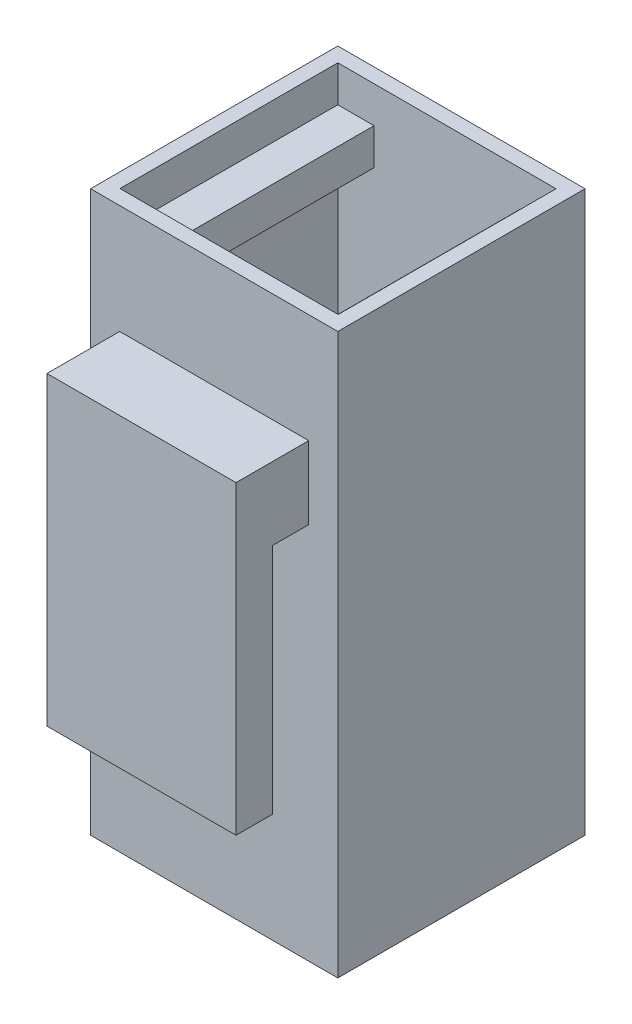
ISO-10303-21;
HEADER;
FILE_DESCRIPTION(('STEP AP214'),'2;1');
FILE_NAME('part.step','',(''),(''),'','','');
FILE_SCHEMA(('AUTOMOTIVE_DESIGN { 1 0 10303 214 1 1 1 1 }'));
ENDSEC;
DATA;
#1=APPLICATION_CONTEXT('core data for automotive mechanical design processes');
#2=APPLICATION_PROTOCOL_DEFINITION('international standard','automotive_design',2000,#1);
#3=PRODUCT_CONTEXT('',#1,'mechanical');
#4=PRODUCT('Part','Part','',(#3));
#5=PRODUCT_RELATED_PRODUCT_CATEGORY('part','',(#4));
#6=PRODUCT_DEFINITION_FORMATION('','',#4);
#7=PRODUCT_DEFINITION_CONTEXT('part definition',#1,'design');
#8=PRODUCT_DEFINITION('design','',#6,#7);
#9=PRODUCT_DEFINITION_SHAPE('','',#8);
#10=(LENGTH_UNIT() NAMED_UNIT(*) SI_UNIT(.MILLI.,.METRE.));
#11=(NAMED_UNIT(*) PLANE_ANGLE_UNIT() SI_UNIT($,.RADIAN.));
#12=(NAMED_UNIT(*) SI_UNIT($,.STERADIAN.) SOLID_ANGLE_UNIT());
#13=UNCERTAINTY_MEASURE_WITH_UNIT(LENGTH_MEASURE(1.E-05),#10,'distance_accuracy_value','');
#14=(GEOMETRIC_REPRESENTATION_CONTEXT(3) GLOBAL_UNCERTAINTY_ASSIGNED_CONTEXT((#13)) GLOBAL_UNIT_ASSIGNED_CONTEXT((#10,
#11,#12)) REPRESENTATION_CONTEXT('',''));
#15=CARTESIAN_POINT('',(0.,0.,0.));
#16=DIRECTION('',(0.,0.,1.));
#17=DIRECTION('',(1.,0.,0.));
#18=AXIS2_PLACEMENT_3D('',#15,#16,#17);
#19=CARTESIAN_POINT('',(-2.,75.,32.));
#20=DIRECTION('',(0.,0.,-1.));
#21=DIRECTION('',(-1.,0.,0.));
#22=AXIS2_PLACEMENT_3D('',#19,#20,#21);
#23=PLANE('',#22);
#24=DIRECTION('',(0.,1.,0.));
#25=VECTOR('',#24,1.);
#26=CARTESIAN_POINT('',(28.,60.,32.));
#27=LINE('',#26,#25);
#28=CARTESIAN_POINT('',(28.,50.,32.));
#29=VERTEX_POINT('',#28);
#30=CARTESIAN_POINT('',(28.,60.,32.));
#31=VERTEX_POINT('',#30);
#32=EDGE_CURVE('E240',#29,#31,#27,.T.);
#33=ORIENTED_EDGE('',*,*,#32,.F.);
#34=DIRECTION('',(-1.,0.,0.));
#35=VECTOR('',#34,1.);
#36=CARTESIAN_POINT('',(30.,50.,32.));
#37=LINE('',#36,#35);
#38=CARTESIAN_POINT('',(2.,50.,32.));
#39=VERTEX_POINT('',#38);
#40=EDGE_CURVE('E202',#29,#39,#37,.T.);
#41=ORIENTED_EDGE('',*,*,#40,.T.);
#42=DIRECTION('',(0.,-1.,0.));
#43=VECTOR('',#42,1.);
#44=CARTESIAN_POINT('',(2.,60.,32.));
#45=LINE('',#44,#43);
#46=CARTESIAN_POINT('',(2.,60.,32.));
#47=VERTEX_POINT('',#46);
#48=EDGE_CURVE('E71',#47,#39,#45,.T.);
#49=ORIENTED_EDGE('',*,*,#48,.F.);
#50=DIRECTION('',(-1.,0.,0.));
#51=VECTOR('',#50,1.);
#52=CARTESIAN_POINT('',(2.,60.,32.));
#53=LINE('',#52,#51);
#54=EDGE_CURVE('E228',#31,#47,#53,.T.);
#55=ORIENTED_EDGE('',*,*,#54,.F.);
#56=EDGE_LOOP('',(#33,#41,#49,#55));
#57=FACE_BOUND('',#56,.T.);
#58=DIRECTION('',(0.,-1.,0.));
#59=VECTOR('',#58,1.);
#60=CARTESIAN_POINT('',(-2.,75.,32.));
#61=LINE('',#60,#59);
#62=CARTESIAN_POINT('',(-2.,75.,32.));
#63=VERTEX_POINT('',#62);
#64=CARTESIAN_POINT('',(-2.,-2.,32.));
#65=VERTEX_POINT('',#64);
#66=EDGE_CURVE('E426',#63,#65,#61,.T.);
#67=ORIENTED_EDGE('',*,*,#66,.T.);
#68=DIRECTION('',(-1.,0.,0.));
#69=VECTOR('',#68,1.);
#70=CARTESIAN_POINT('',(-2.,-2.,32.));
#71=LINE('',#70,#69);
#72=CARTESIAN_POINT('',(32.,-2.,32.));
#73=VERTEX_POINT('',#72);
#74=EDGE_CURVE('E258',#73,#65,#71,.T.);
#75=ORIENTED_EDGE('',*,*,#74,.F.);
#76=DIRECTION('',(0.,-1.,0.));
#77=VECTOR('',#76,1.);
#78=CARTESIAN_POINT('',(32.,75.,32.));
#79=LINE('',#78,#77);
#80=CARTESIAN_POINT('',(32.,75.,32.));
#81=VERTEX_POINT('',#80);
#82=EDGE_CURVE('E423',#81,#73,#79,.T.);
#83=ORIENTED_EDGE('',*,*,#82,.F.);
#84=DIRECTION('',(1.,0.,0.));
#85=VECTOR('',#84,1.);
#86=CARTESIAN_POINT('',(-2.,75.,32.));
#87=LINE('',#86,#85);
#88=EDGE_CURVE('E408',#63,#81,#87,.T.);
#89=ORIENTED_EDGE('',*,*,#88,.F.);
#90=EDGE_LOOP('',(#67,#75,#83,#89));
#91=FACE_BOUND('',#90,.T.);
#92=ADVANCED_FACE('F47',(#57,#91),#23,.F.);
#93=CARTESIAN_POINT('',(0.,75.,0.));
#94=DIRECTION('',(0.,1.,0.));
#95=DIRECTION('',(0.,0.,1.));
#96=AXIS2_PLACEMENT_3D('',#93,#94,#95);
#97=PLANE('',#96);
#98=DIRECTION('',(-1.,0.,0.));
#99=VECTOR('',#98,1.);
#100=CARTESIAN_POINT('',(0.,75.,0.));
#101=LINE('',#100,#99);
#102=CARTESIAN_POINT('',(30.007946466563,75.,0.));
#103=VERTEX_POINT('',#102);
#104=CARTESIAN_POINT('',(0.,75.,0.));
#105=VERTEX_POINT('',#104);
#106=EDGE_CURVE('E373',#103,#105,#101,.T.);
#107=ORIENTED_EDGE('',*,*,#106,.F.);
#108=DIRECTION('',(0.,0.,-1.));
#109=VECTOR('',#108,1.);
#110=CARTESIAN_POINT('',(30.007946466563,75.,0.));
#111=LINE('',#110,#109);
#112=CARTESIAN_POINT('',(30.007946466563,75.,29.9509599856431));
#113=VERTEX_POINT('',#112);
#114=EDGE_CURVE('E279',#113,#103,#111,.T.);
#115=ORIENTED_EDGE('',*,*,#114,.F.);
#116=DIRECTION('',(1.,0.,0.));
#117=VECTOR('',#116,1.);
#118=CARTESIAN_POINT('',(30.007946466563,75.,29.9509599856431));
#119=LINE('',#118,#117);
#120=CARTESIAN_POINT('',(0.,75.,29.9509599856431));
#121=VERTEX_POINT('',#120);
#122=EDGE_CURVE('E309',#121,#113,#119,.T.);
#123=ORIENTED_EDGE('',*,*,#122,.F.);
#124=DIRECTION('',(0.,0.,1.));
#125=VECTOR('',#124,1.);
#126=CARTESIAN_POINT('',(0.,75.,29.9509599856431));
#127=LINE('',#126,#125);
#128=EDGE_CURVE('E274',#105,#121,#127,.T.);
#129=ORIENTED_EDGE('',*,*,#128,.F.);
#130=EDGE_LOOP('',(#107,#115,#123,#129));
#131=FACE_BOUND('',#130,.T.);
#132=DIRECTION('',(0.,0.,1.));
#133=VECTOR('',#132,1.);
#134=CARTESIAN_POINT('',(-2.,75.,-2.));
#135=LINE('',#134,#133);
#136=CARTESIAN_POINT('',(-2.,75.,-2.));
#137=VERTEX_POINT('',#136);
#138=EDGE_CURVE('E404',#137,#63,#135,.T.);
#139=ORIENTED_EDGE('',*,*,#138,.T.);
#140=ORIENTED_EDGE('',*,*,#88,.T.);
#141=DIRECTION('',(0.,0.,-1.));
#142=VECTOR('',#141,1.);
#143=CARTESIAN_POINT('',(32.,75.,-2.));
#144=LINE('',#143,#142);
#145=CARTESIAN_POINT('',(32.,75.,-2.));
#146=VERTEX_POINT('',#145);
#147=EDGE_CURVE('E411',#81,#146,#144,.T.);
#148=ORIENTED_EDGE('',*,*,#147,.T.);
#149=DIRECTION('',(-1.,0.,0.));
#150=VECTOR('',#149,1.);
#151=CARTESIAN_POINT('',(-2.,75.,-2.));
#152=LINE('',#151,#150);
#153=EDGE_CURVE('E414',#146,#137,#152,.T.);
#154=ORIENTED_EDGE('',*,*,#153,.T.);
#155=EDGE_LOOP('',(#139,#140,#148,#154));
#156=FACE_BOUND('',#155,.T.);
#157=ADVANCED_FACE('F446',(#131,#156),#97,.T.);
#158=CARTESIAN_POINT('',(-2.,75.,-2.));
#159=DIRECTION('',(1.,0.,0.));
#160=DIRECTION('',(0.,0.,-1.));
#161=AXIS2_PLACEMENT_3D('',#158,#159,#160);
#162=PLANE('',#161);
#163=DIRECTION('',(0.,-1.,0.));
#164=VECTOR('',#163,1.);
#165=CARTESIAN_POINT('',(-2.,75.,-2.));
#166=LINE('',#165,#164);
#167=CARTESIAN_POINT('',(-2.,-2.,-2.));
#168=VERTEX_POINT('',#167);
#169=EDGE_CURVE('E417',#137,#168,#166,.T.);
#170=ORIENTED_EDGE('',*,*,#169,.T.);
#171=DIRECTION('',(0.,0.,-1.));
#172=VECTOR('',#171,1.);
#173=CARTESIAN_POINT('',(-2.,-2.,32.));
#174=LINE('',#173,#172);
#175=EDGE_CURVE('E262',#65,#168,#174,.T.);
#176=ORIENTED_EDGE('',*,*,#175,.F.);
#177=ORIENTED_EDGE('',*,*,#66,.F.);
#178=ORIENTED_EDGE('',*,*,#138,.F.);
#179=EDGE_LOOP('',(#170,#176,#177,#178));
#180=FACE_BOUND('',#179,.T.);
#181=ADVANCED_FACE('F49',(#180),#162,.F.);
#182=CARTESIAN_POINT('',(32.,75.,-2.));
#183=DIRECTION('',(-1.,0.,0.));
#184=DIRECTION('',(0.,0.,1.));
#185=AXIS2_PLACEMENT_3D('',#182,#183,#184);
#186=PLANE('',#185);
#187=ORIENTED_EDGE('',*,*,#82,.T.);
#188=DIRECTION('',(0.,0.,1.));
#189=VECTOR('',#188,1.);
#190=CARTESIAN_POINT('',(32.,-2.,32.));
#191=LINE('',#190,#189);
#192=CARTESIAN_POINT('',(32.,-2.,-1.99999999999999));
#193=VERTEX_POINT('',#192);
#194=EDGE_CURVE('E270',#193,#73,#191,.T.);
#195=ORIENTED_EDGE('',*,*,#194,.F.);
#196=DIRECTION('',(0.,-1.,0.));
#197=VECTOR('',#196,1.);
#198=CARTESIAN_POINT('',(32.,75.,-2.));
#199=LINE('',#198,#197);
#200=EDGE_CURVE('E420',#146,#193,#199,.T.);
#201=ORIENTED_EDGE('',*,*,#200,.F.);
#202=ORIENTED_EDGE('',*,*,#147,.F.);
#203=EDGE_LOOP('',(#187,#195,#201,#202));
#204=FACE_BOUND('',#203,.T.);
#205=ADVANCED_FACE('F460',(#204),#186,.F.);
#206=CARTESIAN_POINT('',(-2.,75.,-2.));
#207=DIRECTION('',(0.,0.,1.));
#208=DIRECTION('',(1.,0.,0.));
#209=AXIS2_PLACEMENT_3D('',#206,#207,#208);
#210=PLANE('',#209);
#211=ORIENTED_EDGE('',*,*,#200,.T.);
#212=DIRECTION('',(1.,0.,0.));
#213=VECTOR('',#212,1.);
#214=CARTESIAN_POINT('',(-2.,-2.,-2.));
#215=LINE('',#214,#213);
#216=EDGE_CURVE('E266',#168,#193,#215,.T.);
#217=ORIENTED_EDGE('',*,*,#216,.F.);
#218=ORIENTED_EDGE('',*,*,#169,.F.);
#219=ORIENTED_EDGE('',*,*,#153,.F.);
#220=EDGE_LOOP('',(#211,#217,#218,#219));
#221=FACE_BOUND('',#220,.T.);
#222=ADVANCED_FACE('F465',(#221),#210,.F.);
#223=CARTESIAN_POINT('',(0.,75.,0.));
#224=DIRECTION('',(1.,0.,0.));
#225=DIRECTION('',(0.,0.,-1.));
#226=AXIS2_PLACEMENT_3D('',#223,#224,#225);
#227=PLANE('',#226);
#228=DIRECTION('',(0.,0.,1.));
#229=VECTOR('',#228,1.);
#230=CARTESIAN_POINT('',(0.,65.0000000000001,30.));
#231=LINE('',#230,#229);
#232=CARTESIAN_POINT('',(0.,65.0000000000001,0.));
#233=VERTEX_POINT('',#232);
#234=CARTESIAN_POINT('',(0.,65.0000000000001,30.));
#235=VERTEX_POINT('',#234);
#236=EDGE_CURVE('E320',#233,#235,#231,.T.);
#237=ORIENTED_EDGE('',*,*,#236,.T.);
#238=DIRECTION('',(0.,-1.,0.));
#239=VECTOR('',#238,1.);
#240=CARTESIAN_POINT('',(0.,75.,30.));
#241=LINE('',#240,#239);
#242=CARTESIAN_POINT('',(0.,0.,30.));
#243=VERTEX_POINT('',#242);
#244=EDGE_CURVE('E401',#235,#243,#241,.T.);
#245=ORIENTED_EDGE('',*,*,#244,.T.);
#246=DIRECTION('',(0.,0.,1.));
#247=VECTOR('',#246,1.);
#248=CARTESIAN_POINT('',(0.,0.,0.));
#249=LINE('',#248,#247);
#250=CARTESIAN_POINT('',(0.,0.,0.));
#251=VERTEX_POINT('',#250);
#252=EDGE_CURVE('E361',#251,#243,#249,.T.);
#253=ORIENTED_EDGE('',*,*,#252,.F.);
#254=DIRECTION('',(0.,-1.,0.));
#255=VECTOR('',#254,1.);
#256=CARTESIAN_POINT('',(0.,75.,0.));
#257=LINE('',#256,#255);
#258=EDGE_CURVE('E376',#233,#251,#257,.T.);
#259=ORIENTED_EDGE('',*,*,#258,.F.);
#260=EDGE_LOOP('',(#237,#245,#253,#259));
#261=FACE_BOUND('',#260,.T.);
#262=ADVANCED_FACE('F467',(#261),#227,.T.);
#263=CARTESIAN_POINT('',(0.,75.,30.));
#264=DIRECTION('',(0.,0.,-1.));
#265=DIRECTION('',(-1.,0.,0.));
#266=AXIS2_PLACEMENT_3D('',#263,#264,#265);
#267=PLANE('',#266);
#268=DIRECTION('',(1.,0.,0.));
#269=VECTOR('',#268,1.);
#270=CARTESIAN_POINT('',(30.,65.0000000000001,30.));
#271=LINE('',#270,#269);
#272=CARTESIAN_POINT('',(30.,65.0000000000001,30.));
#273=VERTEX_POINT('',#272);
#274=EDGE_CURVE('E332',#235,#273,#271,.T.);
#275=ORIENTED_EDGE('',*,*,#274,.T.);
#276=DIRECTION('',(0.,-1.,0.));
#277=VECTOR('',#276,1.);
#278=CARTESIAN_POINT('',(30.,75.,30.));
#279=LINE('',#278,#277);
#280=CARTESIAN_POINT('',(30.,0.,30.));
#281=VERTEX_POINT('',#280);
#282=EDGE_CURVE('E398',#273,#281,#279,.T.);
#283=ORIENTED_EDGE('',*,*,#282,.T.);
#284=DIRECTION('',(1.,0.,0.));
#285=VECTOR('',#284,1.);
#286=CARTESIAN_POINT('',(0.,0.,30.));
#287=LINE('',#286,#285);
#288=EDGE_CURVE('E381',#243,#281,#287,.T.);
#289=ORIENTED_EDGE('',*,*,#288,.F.);
#290=ORIENTED_EDGE('',*,*,#244,.F.);
#291=EDGE_LOOP('',(#275,#283,#289,#290));
#292=FACE_BOUND('',#291,.T.);
#293=ADVANCED_FACE('F473',(#292),#267,.T.);
#294=CARTESIAN_POINT('',(30.,75.,0.));
#295=DIRECTION('',(-1.,0.,0.));
#296=DIRECTION('',(0.,0.,1.));
#297=AXIS2_PLACEMENT_3D('',#294,#295,#296);
#298=PLANE('',#297);
#299=DIRECTION('',(0.,0.,-1.));
#300=VECTOR('',#299,1.);
#301=CARTESIAN_POINT('',(30.,65.0000000000001,0.));
#302=LINE('',#301,#300);
#303=CARTESIAN_POINT('',(30.,65.0000000000001,0.));
#304=VERTEX_POINT('',#303);
#305=EDGE_CURVE('E335',#273,#304,#302,.T.);
#306=ORIENTED_EDGE('',*,*,#305,.T.);
#307=DIRECTION('',(0.,-1.,0.));
#308=VECTOR('',#307,1.);
#309=CARTESIAN_POINT('',(30.,75.,0.));
#310=LINE('',#309,#308);
#311=CARTESIAN_POINT('',(30.,0.,0.));
#312=VERTEX_POINT('',#311);
#313=EDGE_CURVE('E395',#304,#312,#310,.T.);
#314=ORIENTED_EDGE('',*,*,#313,.T.);
#315=DIRECTION('',(0.,0.,-1.));
#316=VECTOR('',#315,1.);
#317=CARTESIAN_POINT('',(30.,0.,0.));
#318=LINE('',#317,#316);
#319=EDGE_CURVE('E385',#281,#312,#318,.T.);
#320=ORIENTED_EDGE('',*,*,#319,.F.);
#321=ORIENTED_EDGE('',*,*,#282,.F.);
#322=EDGE_LOOP('',(#306,#314,#320,#321));
#323=FACE_BOUND('',#322,.T.);
#324=ADVANCED_FACE('F483',(#323),#298,.T.);
#325=CARTESIAN_POINT('',(0.,75.,0.));
#326=DIRECTION('',(0.,0.,1.));
#327=DIRECTION('',(1.,0.,0.));
#328=AXIS2_PLACEMENT_3D('',#325,#326,#327);
#329=PLANE('',#328);
#330=DIRECTION('',(0.,1.,0.));
#331=VECTOR('',#330,1.);
#332=CARTESIAN_POINT('',(4.98170601426861,65.0000000000001,0.));
#333=LINE('',#332,#331);
#334=CARTESIAN_POINT('',(4.98170601426861,65.0000000000001,0.));
#335=VERTEX_POINT('',#334);
#336=CARTESIAN_POINT('',(4.98170601426861,70.,0.));
#337=VERTEX_POINT('',#336);
#338=EDGE_CURVE('E357',#335,#337,#333,.T.);
#339=ORIENTED_EDGE('',*,*,#338,.F.);
#340=DIRECTION('',(-1.,0.,0.));
#341=VECTOR('',#340,1.);
#342=CARTESIAN_POINT('',(0.,65.0000000000001,0.));
#343=LINE('',#342,#341);
#344=EDGE_CURVE('E353',#335,#233,#343,.T.);
#345=ORIENTED_EDGE('',*,*,#344,.T.);
#346=ORIENTED_EDGE('',*,*,#258,.T.);
#347=DIRECTION('',(-1.,0.,0.));
#348=VECTOR('',#347,1.);
#349=CARTESIAN_POINT('',(0.,0.,0.));
#350=LINE('',#349,#348);
#351=EDGE_CURVE('E377',#312,#251,#350,.T.);
#352=ORIENTED_EDGE('',*,*,#351,.F.);
#353=ORIENTED_EDGE('',*,*,#313,.F.);
#354=DIRECTION('',(-1.,0.,0.));
#355=VECTOR('',#354,1.);
#356=CARTESIAN_POINT('',(24.9817060142686,65.0000000000001,0.));
#357=LINE('',#356,#355);
#358=CARTESIAN_POINT('',(24.9817060142686,65.0000000000001,0.));
#359=VERTEX_POINT('',#358);
#360=EDGE_CURVE('E338',#304,#359,#357,.T.);
#361=ORIENTED_EDGE('',*,*,#360,.T.);
#362=DIRECTION('',(0.,1.,0.));
#363=VECTOR('',#362,1.);
#364=CARTESIAN_POINT('',(24.9817060142686,65.0000000000001,0.));
#365=LINE('',#364,#363);
#366=CARTESIAN_POINT('',(24.9817060142686,70.,0.));
#367=VERTEX_POINT('',#366);
#368=EDGE_CURVE('E356',#359,#367,#365,.T.);
#369=ORIENTED_EDGE('',*,*,#368,.T.);
#370=DIRECTION('',(-1.,0.,0.));
#371=VECTOR('',#370,1.);
#372=CARTESIAN_POINT('',(24.9817060142686,70.,0.));
#373=LINE('',#372,#371);
#374=CARTESIAN_POINT('',(30.007946466563,70.,0.));
#375=VERTEX_POINT('',#374);
#376=EDGE_CURVE('E302',#375,#367,#373,.T.);
#377=ORIENTED_EDGE('',*,*,#376,.F.);
#378=DIRECTION('',(0.,1.,0.));
#379=VECTOR('',#378,1.);
#380=CARTESIAN_POINT('',(30.007946466563,70.,0.));
#381=LINE('',#380,#379);
#382=EDGE_CURVE('E316',#375,#103,#381,.T.);
#383=ORIENTED_EDGE('',*,*,#382,.T.);
#384=ORIENTED_EDGE('',*,*,#106,.T.);
#385=DIRECTION('',(0.,1.,0.));
#386=VECTOR('',#385,1.);
#387=CARTESIAN_POINT('',(0.,70.,0.));
#388=LINE('',#387,#386);
#389=CARTESIAN_POINT('',(0.,70.,0.));
#390=VERTEX_POINT('',#389);
#391=EDGE_CURVE('E305',#390,#105,#388,.T.);
#392=ORIENTED_EDGE('',*,*,#391,.F.);
#393=DIRECTION('',(-1.,0.,0.));
#394=VECTOR('',#393,1.);
#395=CARTESIAN_POINT('',(0.,70.,0.));
#396=LINE('',#395,#394);
#397=EDGE_CURVE('E286',#337,#390,#396,.T.);
#398=ORIENTED_EDGE('',*,*,#397,.F.);
#399=EDGE_LOOP('',(#339,#345,#346,#352,#353,#361,#369,#377,#383,#384,#392,#398));
#400=FACE_BOUND('',#399,.T.);
#401=ADVANCED_FACE('F487',(#400),#329,.T.);
#402=CARTESIAN_POINT('',(4.98170601426861,65.0000000000001,0.));
#403=DIRECTION('',(1.,0.,0.));
#404=DIRECTION('',(0.,0.,-1.));
#405=AXIS2_PLACEMENT_3D('',#402,#403,#404);
#406=PLANE('',#405);
#407=DIRECTION('',(0.,0.,-1.));
#408=VECTOR('',#407,1.);
#409=CARTESIAN_POINT('',(4.98170601426861,70.,0.));
#410=LINE('',#409,#408);
#411=CARTESIAN_POINT('',(4.98170601426861,70.,25.));
#412=VERTEX_POINT('',#411);
#413=EDGE_CURVE('E282',#412,#337,#410,.T.);
#414=ORIENTED_EDGE('',*,*,#413,.F.);
#415=DIRECTION('',(0.,1.,0.));
#416=VECTOR('',#415,1.);
#417=CARTESIAN_POINT('',(4.98170601426861,65.0000000000001,25.));
#418=LINE('',#417,#416);
#419=CARTESIAN_POINT('',(4.98170601426861,65.0000000000001,25.));
#420=VERTEX_POINT('',#419);
#421=EDGE_CURVE('E362',#420,#412,#418,.T.);
#422=ORIENTED_EDGE('',*,*,#421,.F.);
#423=DIRECTION('',(0.,0.,-1.));
#424=VECTOR('',#423,1.);
#425=CARTESIAN_POINT('',(4.98170601426861,65.0000000000001,0.));
#426=LINE('',#425,#424);
#427=EDGE_CURVE('E349',#420,#335,#426,.T.);
#428=ORIENTED_EDGE('',*,*,#427,.T.);
#429=ORIENTED_EDGE('',*,*,#338,.T.);
#430=EDGE_LOOP('',(#414,#422,#428,#429));
#431=FACE_BOUND('',#430,.T.);
#432=ADVANCED_FACE('F491',(#431),#406,.T.);
#433=CARTESIAN_POINT('',(4.98170601426861,65.0000000000001,25.));
#434=DIRECTION('',(0.,0.,-1.));
#435=DIRECTION('',(-1.,0.,0.));
#436=AXIS2_PLACEMENT_3D('',#433,#434,#435);
#437=PLANE('',#436);
#438=DIRECTION('',(-1.,0.,0.));
#439=VECTOR('',#438,1.);
#440=CARTESIAN_POINT('',(4.98170601426861,70.,25.));
#441=LINE('',#440,#439);
#442=CARTESIAN_POINT('',(24.9817060142686,70.,25.));
#443=VERTEX_POINT('',#442);
#444=EDGE_CURVE('E278',#443,#412,#441,.T.);
#445=ORIENTED_EDGE('',*,*,#444,.F.);
#446=DIRECTION('',(0.,1.,0.));
#447=VECTOR('',#446,1.);
#448=CARTESIAN_POINT('',(24.9817060142686,65.0000000000001,25.));
#449=LINE('',#448,#447);
#450=CARTESIAN_POINT('',(24.9817060142686,65.0000000000001,25.));
#451=VERTEX_POINT('',#450);
#452=EDGE_CURVE('E366',#451,#443,#449,.T.);
#453=ORIENTED_EDGE('',*,*,#452,.F.);
#454=DIRECTION('',(-1.,0.,0.));
#455=VECTOR('',#454,1.);
#456=CARTESIAN_POINT('',(4.98170601426861,65.0000000000001,25.));
#457=LINE('',#456,#455);
#458=EDGE_CURVE('E345',#451,#420,#457,.T.);
#459=ORIENTED_EDGE('',*,*,#458,.T.);
#460=ORIENTED_EDGE('',*,*,#421,.T.);
#461=EDGE_LOOP('',(#445,#453,#459,#460));
#462=FACE_BOUND('',#461,.T.);
#463=ADVANCED_FACE('F497',(#462),#437,.T.);
#464=CARTESIAN_POINT('',(24.9817060142686,65.0000000000001,25.));
#465=DIRECTION('',(-1.,0.,0.));
#466=DIRECTION('',(0.,0.,1.));
#467=AXIS2_PLACEMENT_3D('',#464,#465,#466);
#468=PLANE('',#467);
#469=DIRECTION('',(0.,0.,1.));
#470=VECTOR('',#469,1.);
#471=CARTESIAN_POINT('',(24.9817060142686,70.,25.));
#472=LINE('',#471,#470);
#473=EDGE_CURVE('E275',#367,#443,#472,.T.);
#474=ORIENTED_EDGE('',*,*,#473,.F.);
#475=ORIENTED_EDGE('',*,*,#368,.F.);
#476=DIRECTION('',(0.,0.,1.));
#477=VECTOR('',#476,1.);
#478=CARTESIAN_POINT('',(24.9817060142686,65.0000000000001,25.));
#479=LINE('',#478,#477);
#480=EDGE_CURVE('E341',#359,#451,#479,.T.);
#481=ORIENTED_EDGE('',*,*,#480,.T.);
#482=ORIENTED_EDGE('',*,*,#452,.T.);
#483=EDGE_LOOP('',(#474,#475,#481,#482));
#484=FACE_BOUND('',#483,.T.);
#485=ADVANCED_FACE('F493',(#484),#468,.T.);
#486=CARTESIAN_POINT('',(0.,65.0000000000001,0.));
#487=DIRECTION('',(0.,-1.,0.));
#488=DIRECTION('',(0.,0.,-1.));
#489=AXIS2_PLACEMENT_3D('',#486,#487,#488);
#490=PLANE('',#489);
#491=ORIENTED_EDGE('',*,*,#236,.F.);
#492=ORIENTED_EDGE('',*,*,#344,.F.);
#493=ORIENTED_EDGE('',*,*,#427,.F.);
#494=ORIENTED_EDGE('',*,*,#458,.F.);
#495=ORIENTED_EDGE('',*,*,#480,.F.);
#496=ORIENTED_EDGE('',*,*,#360,.F.);
#497=ORIENTED_EDGE('',*,*,#305,.F.);
#498=ORIENTED_EDGE('',*,*,#274,.F.);
#499=EDGE_LOOP('',(#491,#492,#493,#494,#495,#496,#497,#498));
#500=FACE_BOUND('',#499,.T.);
#501=ADVANCED_FACE('F496',(#500),#490,.T.);
#502=CARTESIAN_POINT('',(30.007946466563,70.,0.));
#503=DIRECTION('',(1.,0.,0.));
#504=DIRECTION('',(0.,0.,-1.));
#505=AXIS2_PLACEMENT_3D('',#502,#503,#504);
#506=PLANE('',#505);
#507=ORIENTED_EDGE('',*,*,#114,.T.);
#508=ORIENTED_EDGE('',*,*,#382,.F.);
#509=DIRECTION('',(0.,0.,-1.));
#510=VECTOR('',#509,1.);
#511=CARTESIAN_POINT('',(30.007946466563,70.,0.));
#512=LINE('',#511,#510);
#513=CARTESIAN_POINT('',(30.007946466563,70.,29.9509599856431));
#514=VERTEX_POINT('',#513);
#515=EDGE_CURVE('E298',#514,#375,#512,.T.);
#516=ORIENTED_EDGE('',*,*,#515,.F.);
#517=DIRECTION('',(0.,1.,0.));
#518=VECTOR('',#517,1.);
#519=CARTESIAN_POINT('',(30.007946466563,70.,29.9509599856431));
#520=LINE('',#519,#518);
#521=EDGE_CURVE('E321',#514,#113,#520,.T.);
#522=ORIENTED_EDGE('',*,*,#521,.T.);
#523=EDGE_LOOP('',(#507,#508,#516,#522));
#524=FACE_BOUND('',#523,.T.);
#525=ADVANCED_FACE('F507',(#524),#506,.F.);
#526=CARTESIAN_POINT('',(30.007946466563,70.,29.9509599856431));
#527=DIRECTION('',(0.,0.,1.));
#528=DIRECTION('',(1.,0.,0.));
#529=AXIS2_PLACEMENT_3D('',#526,#527,#528);
#530=PLANE('',#529);
#531=ORIENTED_EDGE('',*,*,#122,.T.);
#532=ORIENTED_EDGE('',*,*,#521,.F.);
#533=DIRECTION('',(1.,0.,0.));
#534=VECTOR('',#533,1.);
#535=CARTESIAN_POINT('',(30.007946466563,70.,29.9509599856431));
#536=LINE('',#535,#534);
#537=CARTESIAN_POINT('',(0.,70.,29.9509599856431));
#538=VERTEX_POINT('',#537);
#539=EDGE_CURVE('E294',#538,#514,#536,.T.);
#540=ORIENTED_EDGE('',*,*,#539,.F.);
#541=DIRECTION('',(0.,1.,0.));
#542=VECTOR('',#541,1.);
#543=CARTESIAN_POINT('',(0.,70.,29.9509599856431));
#544=LINE('',#543,#542);
#545=EDGE_CURVE('E324',#538,#121,#544,.T.);
#546=ORIENTED_EDGE('',*,*,#545,.T.);
#547=EDGE_LOOP('',(#531,#532,#540,#546));
#548=FACE_BOUND('',#547,.T.);
#549=ADVANCED_FACE('F513',(#548),#530,.F.);
#550=CARTESIAN_POINT('',(0.,70.,29.9509599856431));
#551=DIRECTION('',(-1.,0.,0.));
#552=DIRECTION('',(0.,0.,1.));
#553=AXIS2_PLACEMENT_3D('',#550,#551,#552);
#554=PLANE('',#553);
#555=ORIENTED_EDGE('',*,*,#128,.T.);
#556=ORIENTED_EDGE('',*,*,#545,.F.);
#557=DIRECTION('',(0.,0.,1.));
#558=VECTOR('',#557,1.);
#559=CARTESIAN_POINT('',(0.,70.,29.9509599856431));
#560=LINE('',#559,#558);
#561=EDGE_CURVE('E290',#390,#538,#560,.T.);
#562=ORIENTED_EDGE('',*,*,#561,.F.);
#563=ORIENTED_EDGE('',*,*,#391,.T.);
#564=EDGE_LOOP('',(#555,#556,#562,#563));
#565=FACE_BOUND('',#564,.T.);
#566=ADVANCED_FACE('F509',(#565),#554,.F.);
#567=CARTESIAN_POINT('',(0.,70.,0.));
#568=DIRECTION('',(0.,-1.,0.));
#569=DIRECTION('',(0.,0.,-1.));
#570=AXIS2_PLACEMENT_3D('',#567,#568,#569);
#571=PLANE('',#570);
#572=ORIENTED_EDGE('',*,*,#473,.T.);
#573=ORIENTED_EDGE('',*,*,#444,.T.);
#574=ORIENTED_EDGE('',*,*,#413,.T.);
#575=ORIENTED_EDGE('',*,*,#397,.T.);
#576=ORIENTED_EDGE('',*,*,#561,.T.);
#577=ORIENTED_EDGE('',*,*,#539,.T.);
#578=ORIENTED_EDGE('',*,*,#515,.T.);
#579=ORIENTED_EDGE('',*,*,#376,.T.);
#580=EDGE_LOOP('',(#572,#573,#574,#575,#576,#577,#578,#579));
#581=FACE_BOUND('',#580,.T.);
#582=ADVANCED_FACE('F512',(#581),#571,.F.);
#583=CARTESIAN_POINT('',(0.,0.,0.));
#584=DIRECTION('',(0.,1.,0.));
#585=DIRECTION('',(0.,0.,1.));
#586=AXIS2_PLACEMENT_3D('',#583,#584,#585);
#587=PLANE('',#586);
#588=ORIENTED_EDGE('',*,*,#351,.T.);
#589=ORIENTED_EDGE('',*,*,#252,.T.);
#590=ORIENTED_EDGE('',*,*,#288,.T.);
#591=ORIENTED_EDGE('',*,*,#319,.T.);
#592=EDGE_LOOP('',(#588,#589,#590,#591));
#593=FACE_BOUND('',#592,.T.);
#594=ADVANCED_FACE('F523',(#593),#587,.T.);
#595=CARTESIAN_POINT('',(0.,-2.,0.));
#596=DIRECTION('',(0.,1.,0.));
#597=DIRECTION('',(0.,0.,1.));
#598=AXIS2_PLACEMENT_3D('',#595,#596,#597);
#599=PLANE('',#598);
#600=ORIENTED_EDGE('',*,*,#74,.T.);
#601=ORIENTED_EDGE('',*,*,#175,.T.);
#602=ORIENTED_EDGE('',*,*,#216,.T.);
#603=ORIENTED_EDGE('',*,*,#194,.T.);
#604=EDGE_LOOP('',(#600,#601,#602,#603));
#605=FACE_BOUND('',#604,.T.);
#606=ADVANCED_FACE('F456',(#605),#599,.F.);
#607=CARTESIAN_POINT('',(2.,60.,42.));
#608=DIRECTION('',(1.,0.,0.));
#609=DIRECTION('',(0.,1.,0.));
#610=AXIS2_PLACEMENT_3D('',#607,#608,#609);
#611=PLANE('',#610);
#612=ORIENTED_EDGE('',*,*,#48,.T.);
#613=DIRECTION('',(0.,0.,-1.));
#614=VECTOR('',#613,1.);
#615=CARTESIAN_POINT('',(2.,50.,32.));
#616=LINE('',#615,#614);
#617=CARTESIAN_POINT('',(2.,50.,37.));
#618=VERTEX_POINT('',#617);
#619=EDGE_CURVE('E199',#618,#39,#616,.T.);
#620=ORIENTED_EDGE('',*,*,#619,.F.);
#621=DIRECTION('',(0.,1.,0.));
#622=VECTOR('',#621,1.);
#623=CARTESIAN_POINT('',(2.,50.,37.));
#624=LINE('',#623,#622);
#625=CARTESIAN_POINT('',(2.,18.,37.));
#626=VERTEX_POINT('',#625);
#627=EDGE_CURVE('E205',#626,#618,#624,.T.);
#628=ORIENTED_EDGE('',*,*,#627,.F.);
#629=DIRECTION('',(0.,0.,-1.));
#630=VECTOR('',#629,1.);
#631=CARTESIAN_POINT('',(2.,18.,42.));
#632=LINE('',#631,#630);
#633=CARTESIAN_POINT('',(2.,18.,42.));
#634=VERTEX_POINT('',#633);
#635=EDGE_CURVE('E255',#634,#626,#632,.T.);
#636=ORIENTED_EDGE('',*,*,#635,.F.);
#637=DIRECTION('',(0.,-1.,0.));
#638=VECTOR('',#637,1.);
#639=CARTESIAN_POINT('',(2.,60.,42.));
#640=LINE('',#639,#638);
#641=CARTESIAN_POINT('',(2.,60.,42.));
#642=VERTEX_POINT('',#641);
#643=EDGE_CURVE('E223',#642,#634,#640,.T.);
#644=ORIENTED_EDGE('',*,*,#643,.F.);
#645=DIRECTION('',(0.,0.,-1.));
#646=VECTOR('',#645,1.);
#647=CARTESIAN_POINT('',(2.,60.,42.));
#648=LINE('',#647,#646);
#649=EDGE_CURVE('E237',#642,#47,#648,.T.);
#650=ORIENTED_EDGE('',*,*,#649,.T.);
#651=EDGE_LOOP('',(#612,#620,#628,#636,#644,#650));
#652=FACE_BOUND('',#651,.T.);
#653=ADVANCED_FACE('F214',(#652),#611,.F.);
#654=CARTESIAN_POINT('',(2.,18.,42.));
#655=DIRECTION('',(0.,1.,0.));
#656=DIRECTION('',(0.,0.,1.));
#657=AXIS2_PLACEMENT_3D('',#654,#655,#656);
#658=PLANE('',#657);
#659=ORIENTED_EDGE('',*,*,#635,.T.);
#660=DIRECTION('',(1.,0.,0.));
#661=VECTOR('',#660,1.);
#662=CARTESIAN_POINT('',(2.,18.,37.));
#663=LINE('',#662,#661);
#664=CARTESIAN_POINT('',(28.,18.,37.));
#665=VERTEX_POINT('',#664);
#666=EDGE_CURVE('E208',#626,#665,#663,.T.);
#667=ORIENTED_EDGE('',*,*,#666,.T.);
#668=DIRECTION('',(0.,0.,-1.));
#669=VECTOR('',#668,1.);
#670=CARTESIAN_POINT('',(28.,18.,42.));
#671=LINE('',#670,#669);
#672=CARTESIAN_POINT('',(28.,18.,42.));
#673=VERTEX_POINT('',#672);
#674=EDGE_CURVE('E251',#673,#665,#671,.T.);
#675=ORIENTED_EDGE('',*,*,#674,.F.);
#676=DIRECTION('',(1.,0.,0.));
#677=VECTOR('',#676,1.);
#678=CARTESIAN_POINT('',(2.,18.,42.));
#679=LINE('',#678,#677);
#680=EDGE_CURVE('E227',#634,#673,#679,.T.);
#681=ORIENTED_EDGE('',*,*,#680,.F.);
#682=EDGE_LOOP('',(#659,#667,#675,#681));
#683=FACE_BOUND('',#682,.T.);
#684=ADVANCED_FACE('F435',(#683),#658,.F.);
#685=CARTESIAN_POINT('',(28.,60.,42.));
#686=DIRECTION('',(-1.,0.,0.));
#687=DIRECTION('',(0.,-1.,0.));
#688=AXIS2_PLACEMENT_3D('',#685,#686,#687);
#689=PLANE('',#688);
#690=DIRECTION('',(0.,1.,0.));
#691=VECTOR('',#690,1.);
#692=CARTESIAN_POINT('',(28.,60.,37.));
#693=LINE('',#692,#691);
#694=CARTESIAN_POINT('',(28.,50.,37.));
#695=VERTEX_POINT('',#694);
#696=EDGE_CURVE('E56',#665,#695,#693,.T.);
#697=ORIENTED_EDGE('',*,*,#696,.T.);
#698=DIRECTION('',(0.,0.,-1.));
#699=VECTOR('',#698,1.);
#700=CARTESIAN_POINT('',(28.,50.,42.));
#701=LINE('',#700,#699);
#702=EDGE_CURVE('E11',#695,#29,#701,.T.);
#703=ORIENTED_EDGE('',*,*,#702,.T.);
#704=ORIENTED_EDGE('',*,*,#32,.T.);
#705=DIRECTION('',(0.,0.,-1.));
#706=VECTOR('',#705,1.);
#707=CARTESIAN_POINT('',(28.,60.,42.));
#708=LINE('',#707,#706);
#709=CARTESIAN_POINT('',(28.,60.,42.));
#710=VERTEX_POINT('',#709);
#711=EDGE_CURVE('E247',#710,#31,#708,.T.);
#712=ORIENTED_EDGE('',*,*,#711,.F.);
#713=DIRECTION('',(0.,1.,0.));
#714=VECTOR('',#713,1.);
#715=CARTESIAN_POINT('',(28.,60.,42.));
#716=LINE('',#715,#714);
#717=EDGE_CURVE('E231',#673,#710,#716,.T.);
#718=ORIENTED_EDGE('',*,*,#717,.F.);
#719=ORIENTED_EDGE('',*,*,#674,.T.);
#720=EDGE_LOOP('',(#697,#703,#704,#712,#718,#719));
#721=FACE_BOUND('',#720,.T.);
#722=ADVANCED_FACE('F430',(#721),#689,.F.);
#723=CARTESIAN_POINT('',(2.,60.,42.));
#724=DIRECTION('',(0.,-1.,0.));
#725=DIRECTION('',(0.,0.,-1.));
#726=AXIS2_PLACEMENT_3D('',#723,#724,#725);
#727=PLANE('',#726);
#728=ORIENTED_EDGE('',*,*,#54,.T.);
#729=ORIENTED_EDGE('',*,*,#649,.F.);
#730=DIRECTION('',(-1.,0.,0.));
#731=VECTOR('',#730,1.);
#732=CARTESIAN_POINT('',(2.,60.,42.));
#733=LINE('',#732,#731);
#734=EDGE_CURVE('E234',#710,#642,#733,.T.);
#735=ORIENTED_EDGE('',*,*,#734,.F.);
#736=ORIENTED_EDGE('',*,*,#711,.T.);
#737=EDGE_LOOP('',(#728,#729,#735,#736));
#738=FACE_BOUND('',#737,.T.);
#739=ADVANCED_FACE('F443',(#738),#727,.F.);
#740=CARTESIAN_POINT('',(0.,0.,42.));
#741=DIRECTION('',(0.,0.,1.));
#742=DIRECTION('',(1.,0.,0.));
#743=AXIS2_PLACEMENT_3D('',#740,#741,#742);
#744=PLANE('',#743);
#745=ORIENTED_EDGE('',*,*,#643,.T.);
#746=ORIENTED_EDGE('',*,*,#680,.T.);
#747=ORIENTED_EDGE('',*,*,#717,.T.);
#748=ORIENTED_EDGE('',*,*,#734,.T.);
#749=EDGE_LOOP('',(#745,#746,#747,#748));
#750=FACE_BOUND('',#749,.T.);
#751=ADVANCED_FACE('F439',(#750),#744,.T.);
#752=CARTESIAN_POINT('',(30.,50.,32.));
#753=DIRECTION('',(0.,1.,0.));
#754=DIRECTION('',(-1.,0.,0.));
#755=AXIS2_PLACEMENT_3D('',#752,#753,#754);
#756=PLANE('',#755);
#757=DIRECTION('',(-1.,0.,0.));
#758=VECTOR('',#757,1.);
#759=CARTESIAN_POINT('',(30.,50.,37.));
#760=LINE('',#759,#758);
#761=EDGE_CURVE('E63',#695,#618,#760,.T.);
#762=ORIENTED_EDGE('',*,*,#761,.T.);
#763=ORIENTED_EDGE('',*,*,#619,.T.);
#764=ORIENTED_EDGE('',*,*,#40,.F.);
#765=ORIENTED_EDGE('',*,*,#702,.F.);
#766=EDGE_LOOP('',(#762,#763,#764,#765));
#767=FACE_BOUND('',#766,.T.);
#768=ADVANCED_FACE('F197',(#767),#756,.F.);
#769=CARTESIAN_POINT('',(30.,50.,37.));
#770=DIRECTION('',(0.,0.,1.));
#771=DIRECTION('',(1.,0.,0.));
#772=AXIS2_PLACEMENT_3D('',#769,#770,#771);
#773=PLANE('',#772);
#774=ORIENTED_EDGE('',*,*,#627,.T.);
#775=ORIENTED_EDGE('',*,*,#761,.F.);
#776=ORIENTED_EDGE('',*,*,#696,.F.);
#777=ORIENTED_EDGE('',*,*,#666,.F.);
#778=EDGE_LOOP('',(#774,#775,#776,#777));
#779=FACE_BOUND('',#778,.T.);
#780=ADVANCED_FACE('F206',(#779),#773,.F.);
#781=CLOSED_SHELL('',(#92,#157,#181,#205,#222,#262,#293,#324,#401,#432,#463,#485,#501,#525,#549,
#566,#582,#594,#606,#653,#684,#722,#739,#751,#768,#780));
#782=MANIFOLD_SOLID_BREP('B2',#781);
#783=ADVANCED_BREP_SHAPE_REPRESENTATION('',(#18,#782),#14);
#784=SHAPE_DEFINITION_REPRESENTATION(#9,#783);
ENDSEC;
END-ISO-10303-21;
